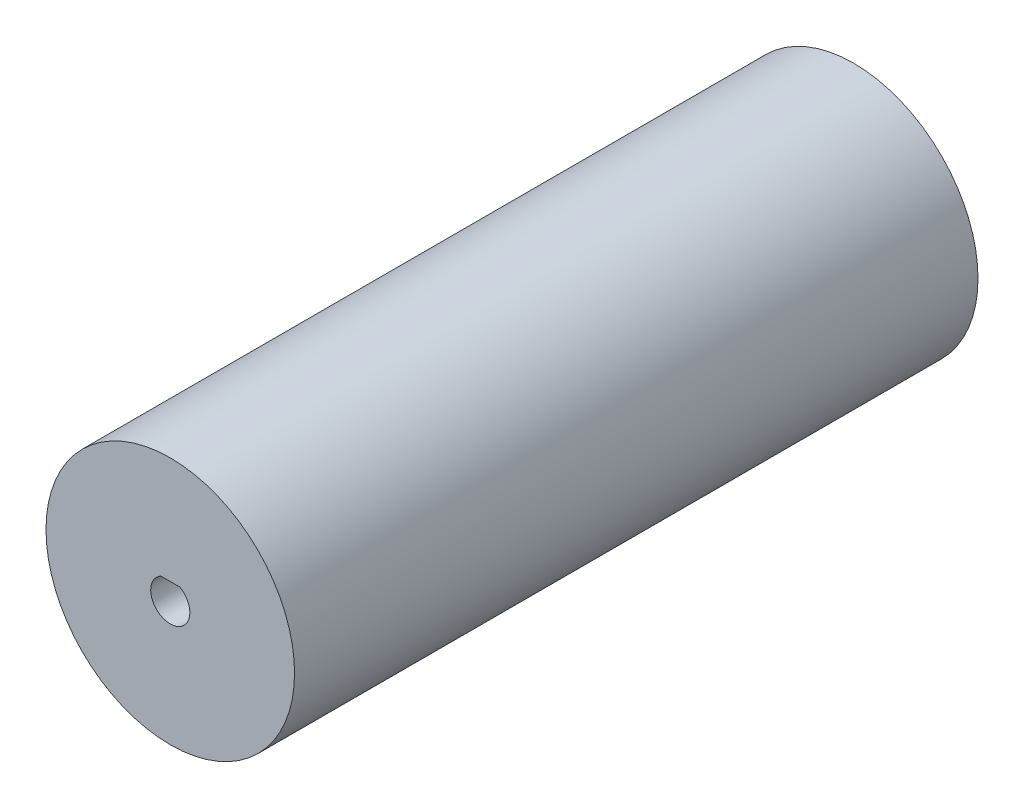
ISO-10303-21;
HEADER;
FILE_DESCRIPTION(('STEP AP214'),'2;1');
FILE_NAME('part.step','',(''),(''),'','','');
FILE_SCHEMA(('AUTOMOTIVE_DESIGN { 1 0 10303 214 1 1 1 1 }'));
ENDSEC;
DATA;
#1=APPLICATION_CONTEXT('core data for automotive mechanical design processes');
#2=APPLICATION_PROTOCOL_DEFINITION('international standard','automotive_design',2000,#1);
#3=PRODUCT_CONTEXT('',#1,'mechanical');
#4=PRODUCT('Part','Part','',(#3));
#5=PRODUCT_RELATED_PRODUCT_CATEGORY('part','',(#4));
#6=PRODUCT_DEFINITION_FORMATION('','',#4);
#7=PRODUCT_DEFINITION_CONTEXT('part definition',#1,'design');
#8=PRODUCT_DEFINITION('design','',#6,#7);
#9=PRODUCT_DEFINITION_SHAPE('','',#8);
#10=(LENGTH_UNIT() NAMED_UNIT(*) SI_UNIT(.MILLI.,.METRE.));
#11=(NAMED_UNIT(*) PLANE_ANGLE_UNIT() SI_UNIT($,.RADIAN.));
#12=(NAMED_UNIT(*) SI_UNIT($,.STERADIAN.) SOLID_ANGLE_UNIT());
#13=UNCERTAINTY_MEASURE_WITH_UNIT(LENGTH_MEASURE(1.E-05),#10,'distance_accuracy_value','');
#14=(GEOMETRIC_REPRESENTATION_CONTEXT(3) GLOBAL_UNCERTAINTY_ASSIGNED_CONTEXT((#13)) GLOBAL_UNIT_ASSIGNED_CONTEXT((#10,
#11,#12)) REPRESENTATION_CONTEXT('',''));
#15=CARTESIAN_POINT('',(0.,0.,0.));
#16=DIRECTION('',(0.,0.,1.));
#17=DIRECTION('',(1.,0.,0.));
#18=AXIS2_PLACEMENT_3D('',#15,#16,#17);
#19=CARTESIAN_POINT('',(0.,0.,69.85));
#20=DIRECTION('',(0.,0.,-1.));
#21=DIRECTION('',(-1.,0.,0.));
#22=AXIS2_PLACEMENT_3D('',#19,#20,#21);
#23=CYLINDRICAL_SURFACE('',#22,12.7);
#24=CARTESIAN_POINT('',(0.,0.,69.85));
#25=DIRECTION('',(0.,0.,1.));
#26=DIRECTION('',(1.,0.,0.));
#27=AXIS2_PLACEMENT_3D('',#24,#25,#26);
#28=CIRCLE('',#27,12.7);
#29=CARTESIAN_POINT('',(12.7,0.,69.85));
#30=VERTEX_POINT('',#29);
#31=EDGE_CURVE('E11',#30,#30,#28,.T.);
#32=ORIENTED_EDGE('',*,*,#31,.F.);
#33=EDGE_LOOP('',(#32));
#34=FACE_BOUND('',#33,.T.);
#35=CARTESIAN_POINT('',(0.,0.,0.));
#36=DIRECTION('',(0.,0.,1.));
#37=DIRECTION('',(1.,0.,0.));
#38=AXIS2_PLACEMENT_3D('',#35,#36,#37);
#39=CIRCLE('',#38,12.7);
#40=CARTESIAN_POINT('',(12.7,0.,0.));
#41=VERTEX_POINT('',#40);
#42=EDGE_CURVE('E42',#41,#41,#39,.T.);
#43=ORIENTED_EDGE('',*,*,#42,.T.);
#44=EDGE_LOOP('',(#43));
#45=FACE_BOUND('',#44,.T.);
#46=ADVANCED_FACE('F39',(#34,#45),#23,.T.);
#47=CARTESIAN_POINT('',(0.,0.,69.85));
#48=DIRECTION('',(0.,0.,1.));
#49=DIRECTION('',(1.,0.,0.));
#50=AXIS2_PLACEMENT_3D('',#47,#48,#49);
#51=PLANE('',#50);
#52=CARTESIAN_POINT('',(0.,0.,69.85));
#53=DIRECTION('',(0.,0.,1.));
#54=DIRECTION('',(1.,0.,0.));
#55=AXIS2_PLACEMENT_3D('',#52,#53,#54);
#56=CIRCLE('',#55,2.);
#57=CARTESIAN_POINT('',(-0.968245836551854,1.75,69.85));
#58=VERTEX_POINT('',#57);
#59=CARTESIAN_POINT('',(0.968245836551854,1.75,69.85));
#60=VERTEX_POINT('',#59);
#61=EDGE_CURVE('E54',#58,#60,#56,.T.);
#62=ORIENTED_EDGE('',*,*,#61,.F.);
#63=DIRECTION('',(-1.,0.,0.));
#64=VECTOR('',#63,1.);
#65=CARTESIAN_POINT('',(-0.968245836551854,1.75,69.85));
#66=LINE('',#65,#64);
#67=EDGE_CURVE('E74',#60,#58,#66,.T.);
#68=ORIENTED_EDGE('',*,*,#67,.F.);
#69=EDGE_LOOP('',(#62,#68));
#70=FACE_BOUND('',#69,.T.);
#71=ORIENTED_EDGE('',*,*,#31,.T.);
#72=EDGE_LOOP('',(#71));
#73=FACE_BOUND('',#72,.T.);
#74=ADVANCED_FACE('F79',(#70,#73),#51,.T.);
#75=CARTESIAN_POINT('',(0.,0.,0.));
#76=DIRECTION('',(0.,0.,1.));
#77=DIRECTION('',(1.,0.,0.));
#78=AXIS2_PLACEMENT_3D('',#75,#76,#77);
#79=PLANE('',#78);
#80=CARTESIAN_POINT('',(0.,0.,0.));
#81=DIRECTION('',(0.,0.,-1.));
#82=DIRECTION('',(-1.,0.,0.));
#83=AXIS2_PLACEMENT_3D('',#80,#81,#82);
#84=CIRCLE('',#83,2.999994);
#85=CARTESIAN_POINT('',(-2.999994,0.,0.));
#86=VERTEX_POINT('',#85);
#87=EDGE_CURVE('E86',#86,#86,#84,.T.);
#88=ORIENTED_EDGE('',*,*,#87,.F.);
#89=EDGE_LOOP('',(#88));
#90=FACE_BOUND('',#89,.T.);
#91=ORIENTED_EDGE('',*,*,#42,.F.);
#92=EDGE_LOOP('',(#91));
#93=FACE_BOUND('',#92,.T.);
#94=ADVANCED_FACE('F103',(#90,#93),#79,.F.);
#95=CARTESIAN_POINT('',(0.,0.,59.85));
#96=DIRECTION('',(0.,0.,1.));
#97=DIRECTION('',(1.,0.,0.));
#98=AXIS2_PLACEMENT_3D('',#95,#96,#97);
#99=CYLINDRICAL_SURFACE('',#98,2.);
#100=ORIENTED_EDGE('',*,*,#61,.T.);
#101=DIRECTION('',(0.,0.,1.));
#102=VECTOR('',#101,1.);
#103=CARTESIAN_POINT('',(0.968245836551854,1.75,59.85));
#104=LINE('',#103,#102);
#105=CARTESIAN_POINT('',(0.968245836551854,1.75,59.85));
#106=VERTEX_POINT('',#105);
#107=EDGE_CURVE('E71',#106,#60,#104,.T.);
#108=ORIENTED_EDGE('',*,*,#107,.F.);
#109=CARTESIAN_POINT('',(0.,0.,59.85));
#110=DIRECTION('',(0.,0.,1.));
#111=DIRECTION('',(1.,0.,0.));
#112=AXIS2_PLACEMENT_3D('',#109,#110,#111);
#113=CIRCLE('',#112,2.);
#114=CARTESIAN_POINT('',(-0.968245836551854,1.75,59.85));
#115=VERTEX_POINT('',#114);
#116=EDGE_CURVE('E68',#115,#106,#113,.T.);
#117=ORIENTED_EDGE('',*,*,#116,.F.);
#118=DIRECTION('',(0.,0.,1.));
#119=VECTOR('',#118,1.);
#120=CARTESIAN_POINT('',(-0.968245836551854,1.75,59.85));
#121=LINE('',#120,#119);
#122=EDGE_CURVE('E62',#115,#58,#121,.T.);
#123=ORIENTED_EDGE('',*,*,#122,.T.);
#124=EDGE_LOOP('',(#100,#108,#117,#123));
#125=FACE_BOUND('',#124,.T.);
#126=ADVANCED_FACE('F66',(#125),#99,.F.);
#127=CARTESIAN_POINT('',(-0.968245836551854,1.75,59.85));
#128=DIRECTION('',(0.,1.,0.));
#129=DIRECTION('',(0.,0.,1.));
#130=AXIS2_PLACEMENT_3D('',#127,#128,#129);
#131=PLANE('',#130);
#132=ORIENTED_EDGE('',*,*,#67,.T.);
#133=ORIENTED_EDGE('',*,*,#122,.F.);
#134=DIRECTION('',(-1.,0.,0.));
#135=VECTOR('',#134,1.);
#136=CARTESIAN_POINT('',(-0.968245836551854,1.75,59.85));
#137=LINE('',#136,#135);
#138=EDGE_CURVE('E89',#106,#115,#137,.T.);
#139=ORIENTED_EDGE('',*,*,#138,.F.);
#140=ORIENTED_EDGE('',*,*,#107,.T.);
#141=EDGE_LOOP('',(#132,#133,#139,#140));
#142=FACE_BOUND('',#141,.T.);
#143=ADVANCED_FACE('F75',(#142),#131,.F.);
#144=CARTESIAN_POINT('',(0.,0.,59.85));
#145=DIRECTION('',(0.,0.,1.));
#146=DIRECTION('',(1.,0.,0.));
#147=AXIS2_PLACEMENT_3D('',#144,#145,#146);
#148=PLANE('',#147);
#149=ORIENTED_EDGE('',*,*,#116,.T.);
#150=ORIENTED_EDGE('',*,*,#138,.T.);
#151=EDGE_LOOP('',(#149,#150));
#152=FACE_BOUND('',#151,.T.);
#153=ADVANCED_FACE('F124',(#152),#148,.T.);
#154=CARTESIAN_POINT('',(0.,0.,34.925));
#155=DIRECTION('',(0.,0.,-1.));
#156=DIRECTION('',(-1.,0.,0.));
#157=AXIS2_PLACEMENT_3D('',#154,#155,#156);
#158=CYLINDRICAL_SURFACE('',#157,2.999994);
#159=CARTESIAN_POINT('',(0.,0.,34.925));
#160=DIRECTION('',(0.,0.,-1.));
#161=DIRECTION('',(-1.,0.,0.));
#162=AXIS2_PLACEMENT_3D('',#159,#160,#161);
#163=CIRCLE('',#162,2.999994);
#164=CARTESIAN_POINT('',(-2.999994,0.,34.925));
#165=VERTEX_POINT('',#164);
#166=EDGE_CURVE('E82',#165,#165,#163,.T.);
#167=ORIENTED_EDGE('',*,*,#166,.F.);
#168=EDGE_LOOP('',(#167));
#169=FACE_BOUND('',#168,.T.);
#170=ORIENTED_EDGE('',*,*,#87,.T.);
#171=EDGE_LOOP('',(#170));
#172=FACE_BOUND('',#171,.T.);
#173=ADVANCED_FACE('F101',(#169,#172),#158,.F.);
#174=CARTESIAN_POINT('',(0.,0.,34.925));
#175=DIRECTION('',(0.,0.,-1.));
#176=DIRECTION('',(-1.,0.,0.));
#177=AXIS2_PLACEMENT_3D('',#174,#175,#176);
#178=PLANE('',#177);
#179=ORIENTED_EDGE('',*,*,#166,.T.);
#180=EDGE_LOOP('',(#179));
#181=FACE_BOUND('',#180,.T.);
#182=ADVANCED_FACE('F129',(#181),#178,.T.);
#183=CLOSED_SHELL('',(#46,#74,#94,#126,#143,#153,#173,#182));
#184=MANIFOLD_SOLID_BREP('B2',#183);
#185=ADVANCED_BREP_SHAPE_REPRESENTATION('',(#18,#184),#14);
#186=SHAPE_DEFINITION_REPRESENTATION(#9,#185);
ENDSEC;
END-ISO-10303-21;
